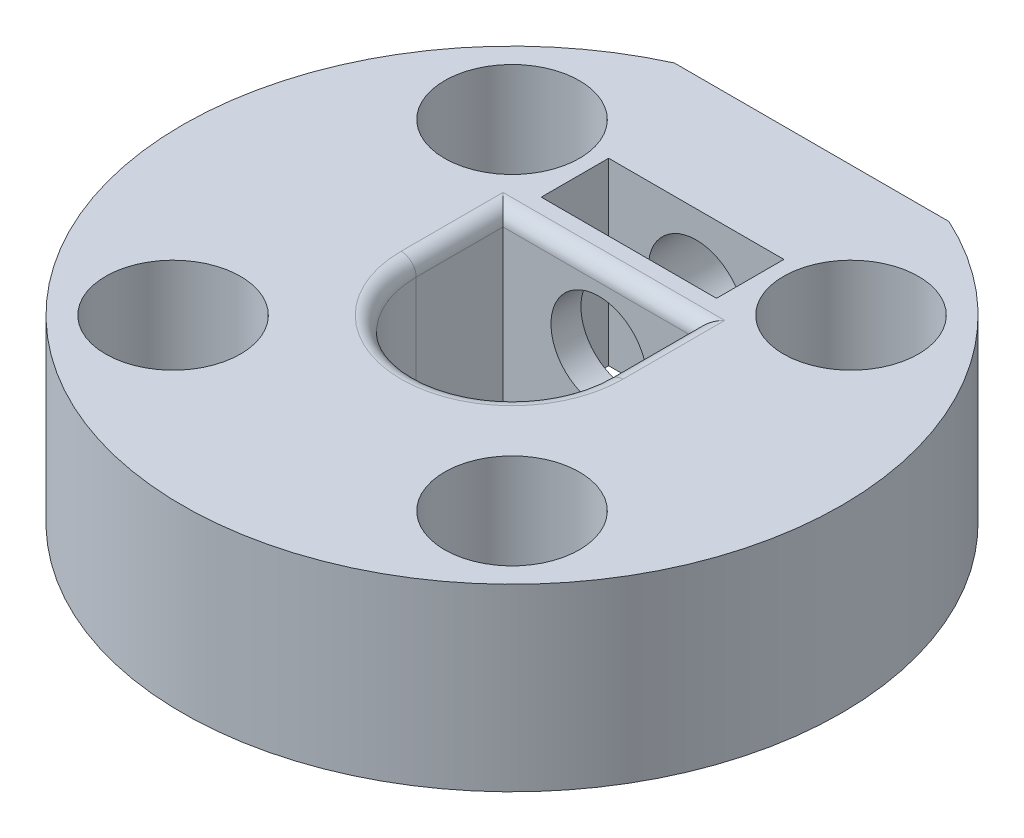
ISO-10303-21;
HEADER;
FILE_DESCRIPTION(('STEP AP214'),'2;1');
FILE_NAME('part.step','',(''),(''),'','','');
FILE_SCHEMA(('AUTOMOTIVE_DESIGN { 1 0 10303 214 1 1 1 1 }'));
ENDSEC;
DATA;
#1=APPLICATION_CONTEXT('core data for automotive mechanical design processes');
#2=APPLICATION_PROTOCOL_DEFINITION('international standard','automotive_design',2000,#1);
#3=PRODUCT_CONTEXT('',#1,'mechanical');
#4=PRODUCT('Part','Part','',(#3));
#5=PRODUCT_RELATED_PRODUCT_CATEGORY('part','',(#4));
#6=PRODUCT_DEFINITION_FORMATION('','',#4);
#7=PRODUCT_DEFINITION_CONTEXT('part definition',#1,'design');
#8=PRODUCT_DEFINITION('design','',#6,#7);
#9=PRODUCT_DEFINITION_SHAPE('','',#8);
#10=(LENGTH_UNIT() NAMED_UNIT(*) SI_UNIT(.MILLI.,.METRE.));
#11=(NAMED_UNIT(*) PLANE_ANGLE_UNIT() SI_UNIT($,.RADIAN.));
#12=(NAMED_UNIT(*) SI_UNIT($,.STERADIAN.) SOLID_ANGLE_UNIT());
#13=UNCERTAINTY_MEASURE_WITH_UNIT(LENGTH_MEASURE(1.E-05),#10,'distance_accuracy_value','');
#14=(GEOMETRIC_REPRESENTATION_CONTEXT(3) GLOBAL_UNCERTAINTY_ASSIGNED_CONTEXT((#13)) GLOBAL_UNIT_ASSIGNED_CONTEXT((#10,
#11,#12)) REPRESENTATION_CONTEXT('',''));
#15=CARTESIAN_POINT('',(0.,0.,0.));
#16=DIRECTION('',(0.,0.,1.));
#17=DIRECTION('',(1.,0.,0.));
#18=AXIS2_PLACEMENT_3D('',#15,#16,#17);
#19=CARTESIAN_POINT('',(0.,3.5,-10.));
#20=DIRECTION('',(0.,0.,1.));
#21=DIRECTION('',(1.,0.,0.));
#22=AXIS2_PLACEMENT_3D('',#19,#20,#21);
#23=CYLINDRICAL_SURFACE('',#22,1.6);
#24=CARTESIAN_POINT('',(0.,3.5,-3.9));
#25=DIRECTION('',(0.,0.,1.));
#26=DIRECTION('',(1.,0.,0.));
#27=AXIS2_PLACEMENT_3D('',#24,#25,#26);
#28=CIRCLE('',#27,1.6);
#29=CARTESIAN_POINT('',(1.6,3.5,-3.9));
#30=VERTEX_POINT('',#29);
#31=EDGE_CURVE('E43',#30,#30,#28,.F.);
#32=ORIENTED_EDGE('',*,*,#31,.T.);
#33=EDGE_LOOP('',(#32));
#34=FACE_BOUND('',#33,.T.);
#35=CARTESIAN_POINT('',(0.,3.5,-2.9));
#36=DIRECTION('',(0.,0.,1.));
#37=DIRECTION('',(1.,0.,0.));
#38=AXIS2_PLACEMENT_3D('',#35,#36,#37);
#39=CIRCLE('',#38,1.6);
#40=CARTESIAN_POINT('',(1.6,3.5,-2.9));
#41=VERTEX_POINT('',#40);
#42=EDGE_CURVE('E184',#41,#41,#39,.T.);
#43=ORIENTED_EDGE('',*,*,#42,.T.);
#44=EDGE_LOOP('',(#43));
#45=FACE_BOUND('',#44,.T.);
#46=ADVANCED_FACE('F39',(#34,#45),#23,.F.);
#47=CARTESIAN_POINT('',(0.,6.,0.));
#48=DIRECTION('',(0.,1.,0.));
#49=DIRECTION('',(0.,0.,1.));
#50=AXIS2_PLACEMENT_3D('',#47,#48,#49);
#51=PLANE('',#50);
#52=DIRECTION('',(0.,0.,-1.));
#53=VECTOR('',#52,1.);
#54=CARTESIAN_POINT('',(2.925,6.,-3.9));
#55=LINE('',#54,#53);
#56=CARTESIAN_POINT('',(2.925,6.,-3.9));
#57=VERTEX_POINT('',#56);
#58=CARTESIAN_POINT('',(2.925,6.,-6.15));
#59=VERTEX_POINT('',#58);
#60=EDGE_CURVE('E57',#57,#59,#55,.T.);
#61=ORIENTED_EDGE('',*,*,#60,.F.);
#62=DIRECTION('',(1.,0.,0.));
#63=VECTOR('',#62,1.);
#64=CARTESIAN_POINT('',(-2.925,6.,-3.9));
#65=LINE('',#64,#63);
#66=CARTESIAN_POINT('',(-2.925,6.,-3.9));
#67=VERTEX_POINT('',#66);
#68=EDGE_CURVE('E152',#67,#57,#65,.T.);
#69=ORIENTED_EDGE('',*,*,#68,.F.);
#70=DIRECTION('',(0.,0.,1.));
#71=VECTOR('',#70,1.);
#72=CARTESIAN_POINT('',(-2.925,6.,-3.9));
#73=LINE('',#72,#71);
#74=CARTESIAN_POINT('',(-2.925,6.,-6.15));
#75=VERTEX_POINT('',#74);
#76=EDGE_CURVE('E156',#75,#67,#73,.T.);
#77=ORIENTED_EDGE('',*,*,#76,.F.);
#78=DIRECTION('',(-1.,0.,0.));
#79=VECTOR('',#78,1.);
#80=CARTESIAN_POINT('',(-2.925,6.,-6.15));
#81=LINE('',#80,#79);
#82=EDGE_CURVE('E165',#59,#75,#81,.T.);
#83=ORIENTED_EDGE('',*,*,#82,.F.);
#84=EDGE_LOOP('',(#61,#69,#77,#83));
#85=FACE_BOUND('',#84,.T.);
#86=DIRECTION('',(0.,0.,1.));
#87=VECTOR('',#86,1.);
#88=CARTESIAN_POINT('',(-3.7,6.,0.));
#89=LINE('',#88,#87);
#90=CARTESIAN_POINT('',(-3.7,6.,0.));
#91=VERTEX_POINT('',#90);
#92=CARTESIAN_POINT('',(-3.7,6.,-3.4));
#93=VERTEX_POINT('',#92);
#94=EDGE_CURVE('E310',#91,#93,#89,.F.);
#95=ORIENTED_EDGE('',*,*,#94,.T.);
#96=DIRECTION('',(-1.,0.,0.));
#97=VECTOR('',#96,1.);
#98=CARTESIAN_POINT('',(0.,6.,-3.4));
#99=LINE('',#98,#97);
#100=CARTESIAN_POINT('',(3.7,6.,-3.4));
#101=VERTEX_POINT('',#100);
#102=EDGE_CURVE('E314',#93,#101,#99,.F.);
#103=ORIENTED_EDGE('',*,*,#102,.T.);
#104=DIRECTION('',(0.,0.,-1.));
#105=VECTOR('',#104,1.);
#106=CARTESIAN_POINT('',(3.7,6.,0.));
#107=LINE('',#106,#105);
#108=CARTESIAN_POINT('',(3.7,6.,0.));
#109=VERTEX_POINT('',#108);
#110=EDGE_CURVE('E307',#101,#109,#107,.F.);
#111=ORIENTED_EDGE('',*,*,#110,.T.);
#112=CARTESIAN_POINT('',(0.,6.,0.));
#113=DIRECTION('',(0.,1.,0.));
#114=DIRECTION('',(0.,0.,1.));
#115=AXIS2_PLACEMENT_3D('',#112,#113,#114);
#116=CIRCLE('',#115,3.7);
#117=EDGE_CURVE('E304',#109,#91,#116,.F.);
#118=ORIENTED_EDGE('',*,*,#117,.T.);
#119=EDGE_LOOP('',(#95,#103,#111,#118));
#120=FACE_BOUND('',#119,.T.);
#121=CARTESIAN_POINT('',(5.65685424949237,6.,-5.65685424949239));
#122=DIRECTION('',(0.,1.,0.));
#123=DIRECTION('',(0.,0.,1.));
#124=AXIS2_PLACEMENT_3D('',#121,#122,#123);
#125=CIRCLE('',#124,2.25);
#126=CARTESIAN_POINT('',(5.65685424949237,6.,-3.40685424949239));
#127=VERTEX_POINT('',#126);
#128=EDGE_CURVE('E185',#127,#127,#125,.T.);
#129=ORIENTED_EDGE('',*,*,#128,.F.);
#130=EDGE_LOOP('',(#129));
#131=FACE_BOUND('',#130,.T.);
#132=CARTESIAN_POINT('',(5.65685424949239,6.,5.65685424949237));
#133=DIRECTION('',(0.,1.,0.));
#134=DIRECTION('',(0.,0.,1.));
#135=AXIS2_PLACEMENT_3D('',#132,#133,#134);
#136=CIRCLE('',#135,2.25);
#137=CARTESIAN_POINT('',(5.65685424949239,6.,7.90685424949237));
#138=VERTEX_POINT('',#137);
#139=EDGE_CURVE('E202',#138,#138,#136,.T.);
#140=ORIENTED_EDGE('',*,*,#139,.F.);
#141=EDGE_LOOP('',(#140));
#142=FACE_BOUND('',#141,.T.);
#143=CARTESIAN_POINT('',(-5.65685424949237,6.,5.65685424949239));
#144=DIRECTION('',(0.,1.,0.));
#145=DIRECTION('',(0.,0.,1.));
#146=AXIS2_PLACEMENT_3D('',#143,#144,#145);
#147=CIRCLE('',#146,2.25);
#148=CARTESIAN_POINT('',(-5.65685424949237,6.,7.90685424949239));
#149=VERTEX_POINT('',#148);
#150=EDGE_CURVE('E218',#149,#149,#147,.T.);
#151=ORIENTED_EDGE('',*,*,#150,.F.);
#152=EDGE_LOOP('',(#151));
#153=FACE_BOUND('',#152,.T.);
#154=CARTESIAN_POINT('',(-5.65685424949239,6.,-5.65685424949237));
#155=DIRECTION('',(0.,1.,0.));
#156=DIRECTION('',(0.,0.,1.));
#157=AXIS2_PLACEMENT_3D('',#154,#155,#156);
#158=CIRCLE('',#157,2.25);
#159=CARTESIAN_POINT('',(-5.65685424949239,6.,-3.40685424949237));
#160=VERTEX_POINT('',#159);
#161=EDGE_CURVE('E234',#160,#160,#158,.T.);
#162=ORIENTED_EDGE('',*,*,#161,.F.);
#163=EDGE_LOOP('',(#162));
#164=FACE_BOUND('',#163,.T.);
#165=CARTESIAN_POINT('',(0.,6.,0.));
#166=DIRECTION('',(0.,1.,0.));
#167=DIRECTION('',(0.,0.,1.));
#168=AXIS2_PLACEMENT_3D('',#165,#166,#167);
#169=CIRCLE('',#168,11.);
#170=CARTESIAN_POINT('',(-4.58257569495584,6.,-10.));
#171=VERTEX_POINT('',#170);
#172=CARTESIAN_POINT('',(4.58257569495584,6.,-10.));
#173=VERTEX_POINT('',#172);
#174=EDGE_CURVE('E279',#171,#173,#169,.T.);
#175=ORIENTED_EDGE('',*,*,#174,.T.);
#176=DIRECTION('',(-1.,0.,0.));
#177=VECTOR('',#176,1.);
#178=CARTESIAN_POINT('',(4.58257569495584,6.,-10.));
#179=LINE('',#178,#177);
#180=EDGE_CURVE('E283',#173,#171,#179,.T.);
#181=ORIENTED_EDGE('',*,*,#180,.T.);
#182=EDGE_LOOP('',(#175,#181));
#183=FACE_BOUND('',#182,.T.);
#184=ADVANCED_FACE('F361',(#85,#120,#131,#142,#153,#164,#183),#51,.T.);
#185=CARTESIAN_POINT('',(0.,0.,0.));
#186=DIRECTION('',(0.,1.,0.));
#187=DIRECTION('',(0.,0.,1.));
#188=AXIS2_PLACEMENT_3D('',#185,#186,#187);
#189=PLANE('',#188);
#190=DIRECTION('',(1.,0.,0.));
#191=VECTOR('',#190,1.);
#192=CARTESIAN_POINT('',(-2.925,0.,-3.9));
#193=LINE('',#192,#191);
#194=CARTESIAN_POINT('',(-2.925,0.,-3.9));
#195=VERTEX_POINT('',#194);
#196=CARTESIAN_POINT('',(2.925,0.,-3.9));
#197=VERTEX_POINT('',#196);
#198=EDGE_CURVE('E139',#195,#197,#193,.T.);
#199=ORIENTED_EDGE('',*,*,#198,.T.);
#200=DIRECTION('',(0.,0.,-1.));
#201=VECTOR('',#200,1.);
#202=CARTESIAN_POINT('',(2.925,0.,-3.9));
#203=LINE('',#202,#201);
#204=CARTESIAN_POINT('',(2.925,0.,-6.15));
#205=VERTEX_POINT('',#204);
#206=EDGE_CURVE('E132',#197,#205,#203,.T.);
#207=ORIENTED_EDGE('',*,*,#206,.T.);
#208=DIRECTION('',(-1.,0.,0.));
#209=VECTOR('',#208,1.);
#210=CARTESIAN_POINT('',(-2.925,0.,-6.15));
#211=LINE('',#210,#209);
#212=CARTESIAN_POINT('',(-2.925,0.,-6.15));
#213=VERTEX_POINT('',#212);
#214=EDGE_CURVE('E142',#205,#213,#211,.T.);
#215=ORIENTED_EDGE('',*,*,#214,.T.);
#216=DIRECTION('',(0.,0.,1.));
#217=VECTOR('',#216,1.);
#218=CARTESIAN_POINT('',(-2.925,0.,-3.9));
#219=LINE('',#218,#217);
#220=EDGE_CURVE('E65',#213,#195,#219,.T.);
#221=ORIENTED_EDGE('',*,*,#220,.T.);
#222=EDGE_LOOP('',(#199,#207,#215,#221));
#223=FACE_BOUND('',#222,.T.);
#224=CARTESIAN_POINT('',(5.65685424949237,0.,-5.65685424949239));
#225=DIRECTION('',(0.,1.,0.));
#226=DIRECTION('',(0.,0.,1.));
#227=AXIS2_PLACEMENT_3D('',#224,#225,#226);
#228=CIRCLE('',#227,1.25);
#229=CARTESIAN_POINT('',(5.65685424949237,0.,-4.40685424949239));
#230=VERTEX_POINT('',#229);
#231=EDGE_CURVE('E198',#230,#230,#228,.T.);
#232=ORIENTED_EDGE('',*,*,#231,.T.);
#233=EDGE_LOOP('',(#232));
#234=FACE_BOUND('',#233,.T.);
#235=CARTESIAN_POINT('',(5.65685424949239,0.,5.65685424949237));
#236=DIRECTION('',(0.,1.,0.));
#237=DIRECTION('',(0.,0.,1.));
#238=AXIS2_PLACEMENT_3D('',#235,#236,#237);
#239=CIRCLE('',#238,1.25);
#240=CARTESIAN_POINT('',(5.65685424949239,0.,6.90685424949237));
#241=VERTEX_POINT('',#240);
#242=EDGE_CURVE('E214',#241,#241,#239,.T.);
#243=ORIENTED_EDGE('',*,*,#242,.T.);
#244=EDGE_LOOP('',(#243));
#245=FACE_BOUND('',#244,.T.);
#246=CARTESIAN_POINT('',(-5.65685424949237,0.,5.65685424949239));
#247=DIRECTION('',(0.,1.,0.));
#248=DIRECTION('',(0.,0.,1.));
#249=AXIS2_PLACEMENT_3D('',#246,#247,#248);
#250=CIRCLE('',#249,1.25);
#251=CARTESIAN_POINT('',(-5.65685424949237,0.,6.90685424949239));
#252=VERTEX_POINT('',#251);
#253=EDGE_CURVE('E230',#252,#252,#250,.T.);
#254=ORIENTED_EDGE('',*,*,#253,.T.);
#255=EDGE_LOOP('',(#254));
#256=FACE_BOUND('',#255,.T.);
#257=CARTESIAN_POINT('',(-5.65685424949239,0.,-5.65685424949237));
#258=DIRECTION('',(0.,1.,0.));
#259=DIRECTION('',(0.,0.,1.));
#260=AXIS2_PLACEMENT_3D('',#257,#258,#259);
#261=CIRCLE('',#260,1.25);
#262=CARTESIAN_POINT('',(-5.65685424949239,0.,-4.40685424949237));
#263=VERTEX_POINT('',#262);
#264=EDGE_CURVE('E246',#263,#263,#261,.T.);
#265=ORIENTED_EDGE('',*,*,#264,.T.);
#266=EDGE_LOOP('',(#265));
#267=FACE_BOUND('',#266,.T.);
#268=CARTESIAN_POINT('',(0.,0.,0.));
#269=DIRECTION('',(0.,1.,0.));
#270=DIRECTION('',(0.,0.,1.));
#271=AXIS2_PLACEMENT_3D('',#268,#269,#270);
#272=CIRCLE('',#271,11.);
#273=CARTESIAN_POINT('',(-4.58257569495584,0.,-10.));
#274=VERTEX_POINT('',#273);
#275=CARTESIAN_POINT('',(4.58257569495584,0.,-10.));
#276=VERTEX_POINT('',#275);
#277=EDGE_CURVE('E278',#274,#276,#272,.T.);
#278=ORIENTED_EDGE('',*,*,#277,.F.);
#279=DIRECTION('',(-1.,0.,0.));
#280=VECTOR('',#279,1.);
#281=CARTESIAN_POINT('',(4.58257569495584,0.,-10.));
#282=LINE('',#281,#280);
#283=EDGE_CURVE('E284',#276,#274,#282,.T.);
#284=ORIENTED_EDGE('',*,*,#283,.F.);
#285=EDGE_LOOP('',(#278,#284));
#286=FACE_BOUND('',#285,.T.);
#287=CARTESIAN_POINT('',(0.,0.,0.));
#288=DIRECTION('',(0.,1.,0.));
#289=DIRECTION('',(0.,0.,1.));
#290=AXIS2_PLACEMENT_3D('',#287,#288,#289);
#291=CIRCLE('',#290,3.2);
#292=CARTESIAN_POINT('',(-3.2,0.,0.));
#293=VERTEX_POINT('',#292);
#294=CARTESIAN_POINT('',(3.2,0.,0.));
#295=VERTEX_POINT('',#294);
#296=EDGE_CURVE('E250',#293,#295,#291,.T.);
#297=ORIENTED_EDGE('',*,*,#296,.T.);
#298=DIRECTION('',(0.,0.,-1.));
#299=VECTOR('',#298,1.);
#300=CARTESIAN_POINT('',(3.2,0.,0.));
#301=LINE('',#300,#299);
#302=CARTESIAN_POINT('',(3.2,0.,-2.9));
#303=VERTEX_POINT('',#302);
#304=EDGE_CURVE('E254',#295,#303,#301,.T.);
#305=ORIENTED_EDGE('',*,*,#304,.T.);
#306=DIRECTION('',(-1.,0.,0.));
#307=VECTOR('',#306,1.);
#308=CARTESIAN_POINT('',(3.2,0.,-2.9));
#309=LINE('',#308,#307);
#310=CARTESIAN_POINT('',(-3.2,0.,-2.9));
#311=VERTEX_POINT('',#310);
#312=EDGE_CURVE('E258',#303,#311,#309,.T.);
#313=ORIENTED_EDGE('',*,*,#312,.T.);
#314=DIRECTION('',(0.,0.,1.));
#315=VECTOR('',#314,1.);
#316=CARTESIAN_POINT('',(-3.2,0.,0.));
#317=LINE('',#316,#315);
#318=EDGE_CURVE('E262',#311,#293,#317,.T.);
#319=ORIENTED_EDGE('',*,*,#318,.T.);
#320=EDGE_LOOP('',(#297,#305,#313,#319));
#321=FACE_BOUND('',#320,.T.);
#322=ADVANCED_FACE('F148',(#223,#234,#245,#256,#267,#286,#321),#189,.F.);
#323=CARTESIAN_POINT('',(0.,6.,0.));
#324=DIRECTION('',(0.,-1.,0.));
#325=DIRECTION('',(0.,0.,-1.));
#326=AXIS2_PLACEMENT_3D('',#323,#324,#325);
#327=CYLINDRICAL_SURFACE('',#326,11.);
#328=ORIENTED_EDGE('',*,*,#277,.T.);
#329=DIRECTION('',(0.,-1.,0.));
#330=VECTOR('',#329,1.);
#331=CARTESIAN_POINT('',(4.58257569495584,6.,-10.));
#332=LINE('',#331,#330);
#333=EDGE_CURVE('E296',#173,#276,#332,.T.);
#334=ORIENTED_EDGE('',*,*,#333,.F.);
#335=ORIENTED_EDGE('',*,*,#174,.F.);
#336=DIRECTION('',(0.,-1.,0.));
#337=VECTOR('',#336,1.);
#338=CARTESIAN_POINT('',(-4.58257569495584,6.,-10.));
#339=LINE('',#338,#337);
#340=EDGE_CURVE('E287',#171,#274,#339,.T.);
#341=ORIENTED_EDGE('',*,*,#340,.T.);
#342=EDGE_LOOP('',(#328,#334,#335,#341));
#343=FACE_BOUND('',#342,.T.);
#344=ADVANCED_FACE('F436',(#343),#327,.T.);
#345=CARTESIAN_POINT('',(4.58257569495584,6.,-10.));
#346=DIRECTION('',(0.,0.,1.));
#347=DIRECTION('',(1.,0.,0.));
#348=AXIS2_PLACEMENT_3D('',#345,#346,#347);
#349=PLANE('',#348);
#350=CARTESIAN_POINT('',(0.,3.5,-10.));
#351=DIRECTION('',(0.,0.,1.));
#352=DIRECTION('',(1.,0.,0.));
#353=AXIS2_PLACEMENT_3D('',#350,#351,#352);
#354=CIRCLE('',#353,1.6);
#355=CARTESIAN_POINT('',(1.6,3.5,-10.));
#356=VERTEX_POINT('',#355);
#357=EDGE_CURVE('E180',#356,#356,#354,.T.);
#358=ORIENTED_EDGE('',*,*,#357,.T.);
#359=EDGE_LOOP('',(#358));
#360=FACE_BOUND('',#359,.T.);
#361=ORIENTED_EDGE('',*,*,#283,.T.);
#362=ORIENTED_EDGE('',*,*,#340,.F.);
#363=ORIENTED_EDGE('',*,*,#180,.F.);
#364=ORIENTED_EDGE('',*,*,#333,.T.);
#365=EDGE_LOOP('',(#361,#362,#363,#364));
#366=FACE_BOUND('',#365,.T.);
#367=ADVANCED_FACE('F431',(#360,#366),#349,.F.);
#368=CARTESIAN_POINT('',(0.,6.,0.));
#369=DIRECTION('',(0.,-1.,0.));
#370=DIRECTION('',(0.,0.,-1.));
#371=AXIS2_PLACEMENT_3D('',#368,#369,#370);
#372=CYLINDRICAL_SURFACE('',#371,3.2);
#373=DIRECTION('',(0.,-1.,0.));
#374=VECTOR('',#373,1.);
#375=CARTESIAN_POINT('',(-3.2,6.,0.));
#376=LINE('',#375,#374);
#377=CARTESIAN_POINT('',(-3.2,5.5,0.));
#378=VERTEX_POINT('',#377);
#379=EDGE_CURVE('E266',#378,#293,#376,.T.);
#380=ORIENTED_EDGE('',*,*,#379,.F.);
#381=CARTESIAN_POINT('',(0.,5.5,0.));
#382=DIRECTION('',(0.,1.,0.));
#383=DIRECTION('',(0.,0.,1.));
#384=AXIS2_PLACEMENT_3D('',#381,#382,#383);
#385=CIRCLE('',#384,3.2);
#386=CARTESIAN_POINT('',(3.2,5.5,0.));
#387=VERTEX_POINT('',#386);
#388=EDGE_CURVE('E11',#378,#387,#385,.T.);
#389=ORIENTED_EDGE('',*,*,#388,.T.);
#390=DIRECTION('',(0.,-1.,0.));
#391=VECTOR('',#390,1.);
#392=CARTESIAN_POINT('',(3.2,6.,0.));
#393=LINE('',#392,#391);
#394=EDGE_CURVE('E275',#387,#295,#393,.T.);
#395=ORIENTED_EDGE('',*,*,#394,.T.);
#396=ORIENTED_EDGE('',*,*,#296,.F.);
#397=EDGE_LOOP('',(#380,#389,#395,#396));
#398=FACE_BOUND('',#397,.T.);
#399=ADVANCED_FACE('F428',(#398),#372,.F.);
#400=CARTESIAN_POINT('',(3.2,6.,0.));
#401=DIRECTION('',(-1.,0.,0.));
#402=DIRECTION('',(0.,0.,1.));
#403=AXIS2_PLACEMENT_3D('',#400,#401,#402);
#404=PLANE('',#403);
#405=ORIENTED_EDGE('',*,*,#394,.F.);
#406=DIRECTION('',(0.,0.,-1.));
#407=VECTOR('',#406,1.);
#408=CARTESIAN_POINT('',(3.2,5.5,0.));
#409=LINE('',#408,#407);
#410=CARTESIAN_POINT('',(3.2,5.5,-2.9));
#411=VERTEX_POINT('',#410);
#412=EDGE_CURVE('E317',#387,#411,#409,.T.);
#413=ORIENTED_EDGE('',*,*,#412,.T.);
#414=DIRECTION('',(0.,-1.,0.));
#415=VECTOR('',#414,1.);
#416=CARTESIAN_POINT('',(3.2,6.,-2.9));
#417=LINE('',#416,#415);
#418=EDGE_CURVE('E272',#411,#303,#417,.T.);
#419=ORIENTED_EDGE('',*,*,#418,.T.);
#420=ORIENTED_EDGE('',*,*,#304,.F.);
#421=EDGE_LOOP('',(#405,#413,#419,#420));
#422=FACE_BOUND('',#421,.T.);
#423=ADVANCED_FACE('F424',(#422),#404,.T.);
#424=CARTESIAN_POINT('',(3.2,6.,-2.9));
#425=DIRECTION('',(0.,0.,1.));
#426=DIRECTION('',(1.,0.,0.));
#427=AXIS2_PLACEMENT_3D('',#424,#425,#426);
#428=PLANE('',#427);
#429=ORIENTED_EDGE('',*,*,#42,.F.);
#430=EDGE_LOOP('',(#429));
#431=FACE_BOUND('',#430,.T.);
#432=ORIENTED_EDGE('',*,*,#418,.F.);
#433=DIRECTION('',(-1.,0.,0.));
#434=VECTOR('',#433,1.);
#435=CARTESIAN_POINT('',(3.2,5.5,-2.9));
#436=LINE('',#435,#434);
#437=CARTESIAN_POINT('',(-3.2,5.5,-2.9));
#438=VERTEX_POINT('',#437);
#439=EDGE_CURVE('E49',#411,#438,#436,.T.);
#440=ORIENTED_EDGE('',*,*,#439,.T.);
#441=DIRECTION('',(0.,-1.,0.));
#442=VECTOR('',#441,1.);
#443=CARTESIAN_POINT('',(-3.2,6.,-2.9));
#444=LINE('',#443,#442);
#445=EDGE_CURVE('E269',#438,#311,#444,.T.);
#446=ORIENTED_EDGE('',*,*,#445,.T.);
#447=ORIENTED_EDGE('',*,*,#312,.F.);
#448=EDGE_LOOP('',(#432,#440,#446,#447));
#449=FACE_BOUND('',#448,.T.);
#450=ADVANCED_FACE('F420',(#431,#449),#428,.T.);
#451=CARTESIAN_POINT('',(-3.2,6.,0.));
#452=DIRECTION('',(1.,0.,0.));
#453=DIRECTION('',(0.,0.,-1.));
#454=AXIS2_PLACEMENT_3D('',#451,#452,#453);
#455=PLANE('',#454);
#456=ORIENTED_EDGE('',*,*,#445,.F.);
#457=DIRECTION('',(0.,0.,1.));
#458=VECTOR('',#457,1.);
#459=CARTESIAN_POINT('',(-3.2,5.5,0.));
#460=LINE('',#459,#458);
#461=EDGE_CURVE('E300',#438,#378,#460,.T.);
#462=ORIENTED_EDGE('',*,*,#461,.T.);
#463=ORIENTED_EDGE('',*,*,#379,.T.);
#464=ORIENTED_EDGE('',*,*,#318,.F.);
#465=EDGE_LOOP('',(#456,#462,#463,#464));
#466=FACE_BOUND('',#465,.T.);
#467=ADVANCED_FACE('F416',(#466),#455,.T.);
#468=CARTESIAN_POINT('',(-5.65685424949239,6.,-5.65685424949237));
#469=DIRECTION('',(0.,1.,0.));
#470=DIRECTION('',(0.,0.,1.));
#471=AXIS2_PLACEMENT_3D('',#468,#469,#470);
#472=CYLINDRICAL_SURFACE('',#471,1.25);
#473=ORIENTED_EDGE('',*,*,#264,.F.);
#474=EDGE_LOOP('',(#473));
#475=FACE_BOUND('',#474,.T.);
#476=CARTESIAN_POINT('',(-5.65685424949239,1.5,-5.65685424949237));
#477=DIRECTION('',(0.,1.,0.));
#478=DIRECTION('',(0.,0.,1.));
#479=AXIS2_PLACEMENT_3D('',#476,#477,#478);
#480=CIRCLE('',#479,1.25);
#481=CARTESIAN_POINT('',(-5.65685424949239,1.5,-4.40685424949237));
#482=VERTEX_POINT('',#481);
#483=EDGE_CURVE('E242',#482,#482,#480,.T.);
#484=ORIENTED_EDGE('',*,*,#483,.T.);
#485=EDGE_LOOP('',(#484));
#486=FACE_BOUND('',#485,.T.);
#487=ADVANCED_FACE('F412',(#475,#486),#472,.F.);
#488=CARTESIAN_POINT('',(-4.40685424949239,1.5,-5.65685424949237));
#489=DIRECTION('',(0.,-1.,0.));
#490=DIRECTION('',(0.,0.,-1.));
#491=AXIS2_PLACEMENT_3D('',#488,#489,#490);
#492=PLANE('',#491);
#493=ORIENTED_EDGE('',*,*,#483,.F.);
#494=EDGE_LOOP('',(#493));
#495=FACE_BOUND('',#494,.T.);
#496=CARTESIAN_POINT('',(-5.65685424949239,1.5,-5.65685424949237));
#497=DIRECTION('',(0.,1.,0.));
#498=DIRECTION('',(0.,0.,1.));
#499=AXIS2_PLACEMENT_3D('',#496,#497,#498);
#500=CIRCLE('',#499,2.25);
#501=CARTESIAN_POINT('',(-5.65685424949239,1.5,-3.40685424949237));
#502=VERTEX_POINT('',#501);
#503=EDGE_CURVE('E238',#502,#502,#500,.T.);
#504=ORIENTED_EDGE('',*,*,#503,.T.);
#505=EDGE_LOOP('',(#504));
#506=FACE_BOUND('',#505,.T.);
#507=ADVANCED_FACE('F408',(#495,#506),#492,.F.);
#508=CARTESIAN_POINT('',(-5.65685424949239,6.,-5.65685424949237));
#509=DIRECTION('',(0.,1.,0.));
#510=DIRECTION('',(0.,0.,1.));
#511=AXIS2_PLACEMENT_3D('',#508,#509,#510);
#512=CYLINDRICAL_SURFACE('',#511,2.25);
#513=ORIENTED_EDGE('',*,*,#503,.F.);
#514=EDGE_LOOP('',(#513));
#515=FACE_BOUND('',#514,.T.);
#516=ORIENTED_EDGE('',*,*,#161,.T.);
#517=EDGE_LOOP('',(#516));
#518=FACE_BOUND('',#517,.T.);
#519=ADVANCED_FACE('F404',(#515,#518),#512,.F.);
#520=CARTESIAN_POINT('',(-5.65685424949237,6.,5.65685424949239));
#521=DIRECTION('',(0.,1.,0.));
#522=DIRECTION('',(0.,0.,1.));
#523=AXIS2_PLACEMENT_3D('',#520,#521,#522);
#524=CYLINDRICAL_SURFACE('',#523,1.25);
#525=ORIENTED_EDGE('',*,*,#253,.F.);
#526=EDGE_LOOP('',(#525));
#527=FACE_BOUND('',#526,.T.);
#528=CARTESIAN_POINT('',(-5.65685424949237,1.5,5.65685424949239));
#529=DIRECTION('',(0.,1.,0.));
#530=DIRECTION('',(0.,0.,1.));
#531=AXIS2_PLACEMENT_3D('',#528,#529,#530);
#532=CIRCLE('',#531,1.25);
#533=CARTESIAN_POINT('',(-5.65685424949237,1.5,6.90685424949239));
#534=VERTEX_POINT('',#533);
#535=EDGE_CURVE('E226',#534,#534,#532,.T.);
#536=ORIENTED_EDGE('',*,*,#535,.T.);
#537=EDGE_LOOP('',(#536));
#538=FACE_BOUND('',#537,.T.);
#539=ADVANCED_FACE('F400',(#527,#538),#524,.F.);
#540=CARTESIAN_POINT('',(-4.40685424949237,1.5,5.65685424949239));
#541=DIRECTION('',(0.,-1.,0.));
#542=DIRECTION('',(0.,0.,-1.));
#543=AXIS2_PLACEMENT_3D('',#540,#541,#542);
#544=PLANE('',#543);
#545=ORIENTED_EDGE('',*,*,#535,.F.);
#546=EDGE_LOOP('',(#545));
#547=FACE_BOUND('',#546,.T.);
#548=CARTESIAN_POINT('',(-5.65685424949237,1.5,5.65685424949239));
#549=DIRECTION('',(0.,1.,0.));
#550=DIRECTION('',(0.,0.,1.));
#551=AXIS2_PLACEMENT_3D('',#548,#549,#550);
#552=CIRCLE('',#551,2.25);
#553=CARTESIAN_POINT('',(-5.65685424949237,1.5,7.90685424949239));
#554=VERTEX_POINT('',#553);
#555=EDGE_CURVE('E222',#554,#554,#552,.T.);
#556=ORIENTED_EDGE('',*,*,#555,.T.);
#557=EDGE_LOOP('',(#556));
#558=FACE_BOUND('',#557,.T.);
#559=ADVANCED_FACE('F396',(#547,#558),#544,.F.);
#560=CARTESIAN_POINT('',(-5.65685424949237,6.,5.65685424949239));
#561=DIRECTION('',(0.,1.,0.));
#562=DIRECTION('',(0.,0.,1.));
#563=AXIS2_PLACEMENT_3D('',#560,#561,#562);
#564=CYLINDRICAL_SURFACE('',#563,2.25);
#565=ORIENTED_EDGE('',*,*,#555,.F.);
#566=EDGE_LOOP('',(#565));
#567=FACE_BOUND('',#566,.T.);
#568=ORIENTED_EDGE('',*,*,#150,.T.);
#569=EDGE_LOOP('',(#568));
#570=FACE_BOUND('',#569,.T.);
#571=ADVANCED_FACE('F392',(#567,#570),#564,.F.);
#572=CARTESIAN_POINT('',(5.65685424949239,6.,5.65685424949237));
#573=DIRECTION('',(0.,1.,0.));
#574=DIRECTION('',(0.,0.,1.));
#575=AXIS2_PLACEMENT_3D('',#572,#573,#574);
#576=CYLINDRICAL_SURFACE('',#575,1.25);
#577=ORIENTED_EDGE('',*,*,#242,.F.);
#578=EDGE_LOOP('',(#577));
#579=FACE_BOUND('',#578,.T.);
#580=CARTESIAN_POINT('',(5.65685424949239,1.5,5.65685424949237));
#581=DIRECTION('',(0.,1.,0.));
#582=DIRECTION('',(0.,0.,1.));
#583=AXIS2_PLACEMENT_3D('',#580,#581,#582);
#584=CIRCLE('',#583,1.25);
#585=CARTESIAN_POINT('',(5.65685424949239,1.5,6.90685424949237));
#586=VERTEX_POINT('',#585);
#587=EDGE_CURVE('E210',#586,#586,#584,.T.);
#588=ORIENTED_EDGE('',*,*,#587,.T.);
#589=EDGE_LOOP('',(#588));
#590=FACE_BOUND('',#589,.T.);
#591=ADVANCED_FACE('F388',(#579,#590),#576,.F.);
#592=CARTESIAN_POINT('',(6.90685424949239,1.5,5.65685424949237));
#593=DIRECTION('',(0.,-1.,0.));
#594=DIRECTION('',(0.,0.,-1.));
#595=AXIS2_PLACEMENT_3D('',#592,#593,#594);
#596=PLANE('',#595);
#597=ORIENTED_EDGE('',*,*,#587,.F.);
#598=EDGE_LOOP('',(#597));
#599=FACE_BOUND('',#598,.T.);
#600=CARTESIAN_POINT('',(5.65685424949239,1.5,5.65685424949237));
#601=DIRECTION('',(0.,1.,0.));
#602=DIRECTION('',(0.,0.,1.));
#603=AXIS2_PLACEMENT_3D('',#600,#601,#602);
#604=CIRCLE('',#603,2.25);
#605=CARTESIAN_POINT('',(5.65685424949239,1.5,7.90685424949237));
#606=VERTEX_POINT('',#605);
#607=EDGE_CURVE('E206',#606,#606,#604,.T.);
#608=ORIENTED_EDGE('',*,*,#607,.T.);
#609=EDGE_LOOP('',(#608));
#610=FACE_BOUND('',#609,.T.);
#611=ADVANCED_FACE('F384',(#599,#610),#596,.F.);
#612=CARTESIAN_POINT('',(5.65685424949239,6.,5.65685424949237));
#613=DIRECTION('',(0.,1.,0.));
#614=DIRECTION('',(0.,0.,1.));
#615=AXIS2_PLACEMENT_3D('',#612,#613,#614);
#616=CYLINDRICAL_SURFACE('',#615,2.25);
#617=ORIENTED_EDGE('',*,*,#607,.F.);
#618=EDGE_LOOP('',(#617));
#619=FACE_BOUND('',#618,.T.);
#620=ORIENTED_EDGE('',*,*,#139,.T.);
#621=EDGE_LOOP('',(#620));
#622=FACE_BOUND('',#621,.T.);
#623=ADVANCED_FACE('F380',(#619,#622),#616,.F.);
#624=CARTESIAN_POINT('',(5.65685424949237,6.,-5.65685424949239));
#625=DIRECTION('',(0.,1.,0.));
#626=DIRECTION('',(0.,0.,1.));
#627=AXIS2_PLACEMENT_3D('',#624,#625,#626);
#628=CYLINDRICAL_SURFACE('',#627,1.25);
#629=ORIENTED_EDGE('',*,*,#231,.F.);
#630=EDGE_LOOP('',(#629));
#631=FACE_BOUND('',#630,.T.);
#632=CARTESIAN_POINT('',(5.65685424949237,1.5,-5.65685424949239));
#633=DIRECTION('',(0.,1.,0.));
#634=DIRECTION('',(0.,0.,1.));
#635=AXIS2_PLACEMENT_3D('',#632,#633,#634);
#636=CIRCLE('',#635,1.25);
#637=CARTESIAN_POINT('',(5.65685424949237,1.5,-4.40685424949239));
#638=VERTEX_POINT('',#637);
#639=EDGE_CURVE('E194',#638,#638,#636,.T.);
#640=ORIENTED_EDGE('',*,*,#639,.T.);
#641=EDGE_LOOP('',(#640));
#642=FACE_BOUND('',#641,.T.);
#643=ADVANCED_FACE('F376',(#631,#642),#628,.F.);
#644=CARTESIAN_POINT('',(6.90685424949237,1.5,-5.65685424949239));
#645=DIRECTION('',(0.,-1.,0.));
#646=DIRECTION('',(0.,0.,-1.));
#647=AXIS2_PLACEMENT_3D('',#644,#645,#646);
#648=PLANE('',#647);
#649=ORIENTED_EDGE('',*,*,#639,.F.);
#650=EDGE_LOOP('',(#649));
#651=FACE_BOUND('',#650,.T.);
#652=CARTESIAN_POINT('',(5.65685424949237,1.5,-5.65685424949239));
#653=DIRECTION('',(0.,1.,0.));
#654=DIRECTION('',(0.,0.,1.));
#655=AXIS2_PLACEMENT_3D('',#652,#653,#654);
#656=CIRCLE('',#655,2.25);
#657=CARTESIAN_POINT('',(5.65685424949237,1.5,-3.40685424949239));
#658=VERTEX_POINT('',#657);
#659=EDGE_CURVE('E189',#658,#658,#656,.T.);
#660=ORIENTED_EDGE('',*,*,#659,.T.);
#661=EDGE_LOOP('',(#660));
#662=FACE_BOUND('',#661,.T.);
#663=ADVANCED_FACE('F372',(#651,#662),#648,.F.);
#664=CARTESIAN_POINT('',(5.65685424949237,6.,-5.65685424949239));
#665=DIRECTION('',(0.,1.,0.));
#666=DIRECTION('',(0.,0.,1.));
#667=AXIS2_PLACEMENT_3D('',#664,#665,#666);
#668=CYLINDRICAL_SURFACE('',#667,2.25);
#669=ORIENTED_EDGE('',*,*,#659,.F.);
#670=EDGE_LOOP('',(#669));
#671=FACE_BOUND('',#670,.T.);
#672=ORIENTED_EDGE('',*,*,#128,.T.);
#673=EDGE_LOOP('',(#672));
#674=FACE_BOUND('',#673,.T.);
#675=ADVANCED_FACE('F369',(#671,#674),#668,.F.);
#676=CARTESIAN_POINT('',(3.7,5.5,0.));
#677=DIRECTION('',(0.,0.,-1.));
#678=DIRECTION('',(-1.,0.,0.));
#679=AXIS2_PLACEMENT_3D('',#676,#677,#678);
#680=CYLINDRICAL_SURFACE('',#679,0.5);
#681=CARTESIAN_POINT('',(3.7,5.5,0.));
#682=DIRECTION('',(0.,0.,1.));
#683=DIRECTION('',(1.,0.,0.));
#684=AXIS2_PLACEMENT_3D('',#681,#682,#683);
#685=CIRCLE('',#684,0.5);
#686=EDGE_CURVE('E328',#109,#387,#685,.T.);
#687=ORIENTED_EDGE('',*,*,#686,.F.);
#688=ORIENTED_EDGE('',*,*,#110,.F.);
#689=CARTESIAN_POINT('',(3.7,5.5,-3.4));
#690=DIRECTION('',(-0.707106781186548,0.,-0.707106781186547));
#691=DIRECTION('',(0.707106781186547,0.,-0.707106781186548));
#692=AXIS2_PLACEMENT_3D('',#689,#690,#691);
#693=ELLIPSE('',#692,0.707106781186547,0.5);
#694=EDGE_CURVE('E190',#411,#101,#693,.T.);
#695=ORIENTED_EDGE('',*,*,#694,.F.);
#696=ORIENTED_EDGE('',*,*,#412,.F.);
#697=EDGE_LOOP('',(#687,#688,#695,#696));
#698=FACE_BOUND('',#697,.T.);
#699=ADVANCED_FACE('F41',(#698),#680,.T.);
#700=CARTESIAN_POINT('',(3.2,5.5,-3.4));
#701=DIRECTION('',(-1.,0.,0.));
#702=DIRECTION('',(0.,0.,1.));
#703=AXIS2_PLACEMENT_3D('',#700,#701,#702);
#704=CYLINDRICAL_SURFACE('',#703,0.5);
#705=ORIENTED_EDGE('',*,*,#694,.T.);
#706=ORIENTED_EDGE('',*,*,#102,.F.);
#707=CARTESIAN_POINT('',(-3.7,5.5,-3.4));
#708=DIRECTION('',(-0.707106781186548,0.,0.707106781186547));
#709=DIRECTION('',(0.707106781186547,0.,0.707106781186548));
#710=AXIS2_PLACEMENT_3D('',#707,#708,#709);
#711=ELLIPSE('',#710,0.707106781186547,0.5);
#712=EDGE_CURVE('E325',#438,#93,#711,.T.);
#713=ORIENTED_EDGE('',*,*,#712,.F.);
#714=ORIENTED_EDGE('',*,*,#439,.F.);
#715=EDGE_LOOP('',(#705,#706,#713,#714));
#716=FACE_BOUND('',#715,.T.);
#717=ADVANCED_FACE('F448',(#716),#704,.T.);
#718=CARTESIAN_POINT('',(0.,5.5,0.));
#719=DIRECTION('',(0.,1.,0.));
#720=DIRECTION('',(0.,0.,1.));
#721=AXIS2_PLACEMENT_3D('',#718,#719,#720);
#722=TOROIDAL_SURFACE('',#721,3.7,0.5);
#723=ORIENTED_EDGE('',*,*,#686,.T.);
#724=ORIENTED_EDGE('',*,*,#388,.F.);
#725=CARTESIAN_POINT('',(-3.7,5.5,0.));
#726=DIRECTION('',(0.,0.,-1.));
#727=DIRECTION('',(-1.,0.,0.));
#728=AXIS2_PLACEMENT_3D('',#725,#726,#727);
#729=CIRCLE('',#728,0.5);
#730=EDGE_CURVE('E322',#91,#378,#729,.T.);
#731=ORIENTED_EDGE('',*,*,#730,.F.);
#732=ORIENTED_EDGE('',*,*,#117,.F.);
#733=EDGE_LOOP('',(#723,#724,#731,#732));
#734=FACE_BOUND('',#733,.T.);
#735=ADVANCED_FACE('F445',(#734),#722,.T.);
#736=CARTESIAN_POINT('',(-3.7,5.5,0.));
#737=DIRECTION('',(0.,0.,1.));
#738=DIRECTION('',(1.,0.,0.));
#739=AXIS2_PLACEMENT_3D('',#736,#737,#738);
#740=CYLINDRICAL_SURFACE('',#739,0.5);
#741=ORIENTED_EDGE('',*,*,#712,.T.);
#742=ORIENTED_EDGE('',*,*,#94,.F.);
#743=ORIENTED_EDGE('',*,*,#730,.T.);
#744=ORIENTED_EDGE('',*,*,#461,.F.);
#745=EDGE_LOOP('',(#741,#742,#743,#744));
#746=FACE_BOUND('',#745,.T.);
#747=ADVANCED_FACE('F357',(#746),#740,.T.);
#748=CARTESIAN_POINT('',(0.,3.5,-6.15));
#749=DIRECTION('',(0.,0.,-1.));
#750=DIRECTION('',(-1.,0.,0.));
#751=AXIS2_PLACEMENT_3D('',#748,#749,#750);
#752=CIRCLE('',#751,1.6);
#753=CARTESIAN_POINT('',(-1.6,3.5,-6.15));
#754=VERTEX_POINT('',#753);
#755=EDGE_CURVE('E174',#754,#754,#752,.F.);
#756=ORIENTED_EDGE('',*,*,#755,.T.);
#757=EDGE_LOOP('',(#756));
#758=FACE_BOUND('',#757,.T.);
#759=ORIENTED_EDGE('',*,*,#357,.F.);
#760=EDGE_LOOP('',(#759));
#761=FACE_BOUND('',#760,.T.);
#762=ADVANCED_FACE('F349',(#758,#761),#23,.F.);
#763=CARTESIAN_POINT('',(-2.925,0.,-3.9));
#764=DIRECTION('',(0.,0.,1.));
#765=DIRECTION('',(1.,0.,0.));
#766=AXIS2_PLACEMENT_3D('',#763,#764,#765);
#767=PLANE('',#766);
#768=ORIENTED_EDGE('',*,*,#68,.T.);
#769=DIRECTION('',(0.,1.,0.));
#770=VECTOR('',#769,1.);
#771=CARTESIAN_POINT('',(2.925,0.,-3.9));
#772=LINE('',#771,#770);
#773=EDGE_CURVE('E171',#197,#57,#772,.T.);
#774=ORIENTED_EDGE('',*,*,#773,.F.);
#775=ORIENTED_EDGE('',*,*,#198,.F.);
#776=DIRECTION('',(0.,1.,0.));
#777=VECTOR('',#776,1.);
#778=CARTESIAN_POINT('',(-2.925,0.,-3.9));
#779=LINE('',#778,#777);
#780=EDGE_CURVE('E175',#195,#67,#779,.T.);
#781=ORIENTED_EDGE('',*,*,#780,.T.);
#782=EDGE_LOOP('',(#768,#774,#775,#781));
#783=FACE_BOUND('',#782,.T.);
#784=ORIENTED_EDGE('',*,*,#31,.F.);
#785=EDGE_LOOP('',(#784));
#786=FACE_BOUND('',#785,.T.);
#787=ADVANCED_FACE('F347',(#783,#786),#767,.F.);
#788=CARTESIAN_POINT('',(-2.925,0.,-6.15));
#789=DIRECTION('',(0.,0.,-1.));
#790=DIRECTION('',(-1.,0.,0.));
#791=AXIS2_PLACEMENT_3D('',#788,#789,#790);
#792=PLANE('',#791);
#793=ORIENTED_EDGE('',*,*,#82,.T.);
#794=DIRECTION('',(0.,1.,0.));
#795=VECTOR('',#794,1.);
#796=CARTESIAN_POINT('',(-2.925,0.,-6.15));
#797=LINE('',#796,#795);
#798=EDGE_CURVE('E138',#213,#75,#797,.T.);
#799=ORIENTED_EDGE('',*,*,#798,.F.);
#800=ORIENTED_EDGE('',*,*,#214,.F.);
#801=DIRECTION('',(0.,1.,0.));
#802=VECTOR('',#801,1.);
#803=CARTESIAN_POINT('',(2.925,0.,-6.15));
#804=LINE('',#803,#802);
#805=EDGE_CURVE('E128',#205,#59,#804,.T.);
#806=ORIENTED_EDGE('',*,*,#805,.T.);
#807=EDGE_LOOP('',(#793,#799,#800,#806));
#808=FACE_BOUND('',#807,.T.);
#809=ORIENTED_EDGE('',*,*,#755,.F.);
#810=EDGE_LOOP('',(#809));
#811=FACE_BOUND('',#810,.T.);
#812=ADVANCED_FACE('F143',(#808,#811),#792,.F.);
#813=CARTESIAN_POINT('',(2.925,0.,-3.9));
#814=DIRECTION('',(1.,0.,0.));
#815=DIRECTION('',(0.,0.,-1.));
#816=AXIS2_PLACEMENT_3D('',#813,#814,#815);
#817=PLANE('',#816);
#818=ORIENTED_EDGE('',*,*,#60,.T.);
#819=ORIENTED_EDGE('',*,*,#805,.F.);
#820=ORIENTED_EDGE('',*,*,#206,.F.);
#821=ORIENTED_EDGE('',*,*,#773,.T.);
#822=EDGE_LOOP('',(#818,#819,#820,#821));
#823=FACE_BOUND('',#822,.T.);
#824=ADVANCED_FACE('F130',(#823),#817,.F.);
#825=CARTESIAN_POINT('',(-2.925,0.,-3.9));
#826=DIRECTION('',(-1.,0.,0.));
#827=DIRECTION('',(0.,0.,1.));
#828=AXIS2_PLACEMENT_3D('',#825,#826,#827);
#829=PLANE('',#828);
#830=ORIENTED_EDGE('',*,*,#76,.T.);
#831=ORIENTED_EDGE('',*,*,#780,.F.);
#832=ORIENTED_EDGE('',*,*,#220,.F.);
#833=ORIENTED_EDGE('',*,*,#798,.T.);
#834=EDGE_LOOP('',(#830,#831,#832,#833));
#835=FACE_BOUND('',#834,.T.);
#836=ADVANCED_FACE('F609',(#835),#829,.F.);
#837=CLOSED_SHELL('',(#46,#184,#322,#344,#367,#399,#423,#450,#467,#487,#507,#519,#539,#559,#571,
#591,#611,#623,#643,#663,#675,#699,#717,#735,#747,#762,#787,#812,#824,#836));
#838=MANIFOLD_SOLID_BREP('B2',#837);
#839=ADVANCED_BREP_SHAPE_REPRESENTATION('',(#18,#838),#14);
#840=SHAPE_DEFINITION_REPRESENTATION(#9,#839);
ENDSEC;
END-ISO-10303-21;
